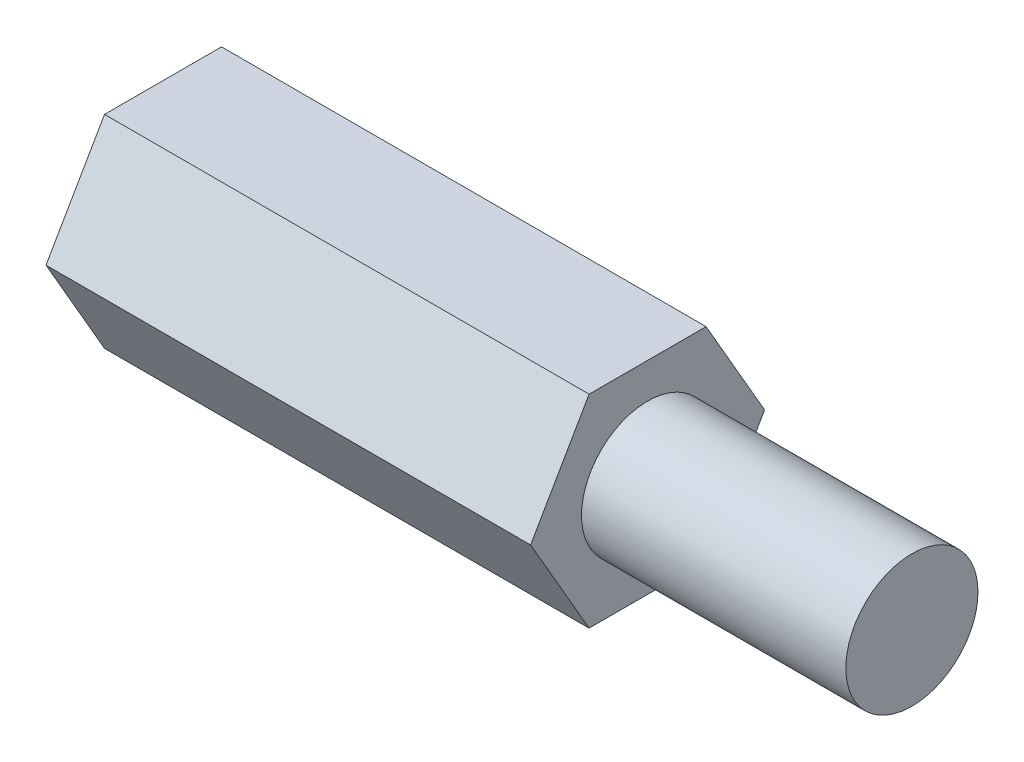
ISO-10303-21;
HEADER;
FILE_DESCRIPTION(('STEP AP214'),'2;1');
FILE_NAME('part.step','',(''),(''),'','','');
FILE_SCHEMA(('AUTOMOTIVE_DESIGN { 1 0 10303 214 1 1 1 1 }'));
ENDSEC;
DATA;
#1=APPLICATION_CONTEXT('core data for automotive mechanical design processes');
#2=APPLICATION_PROTOCOL_DEFINITION('international standard','automotive_design',2000,#1);
#3=PRODUCT_CONTEXT('',#1,'mechanical');
#4=PRODUCT('Part','Part','',(#3));
#5=PRODUCT_RELATED_PRODUCT_CATEGORY('part','',(#4));
#6=PRODUCT_DEFINITION_FORMATION('','',#4);
#7=PRODUCT_DEFINITION_CONTEXT('part definition',#1,'design');
#8=PRODUCT_DEFINITION('design','',#6,#7);
#9=PRODUCT_DEFINITION_SHAPE('','',#8);
#10=(LENGTH_UNIT() NAMED_UNIT(*) SI_UNIT(.MILLI.,.METRE.));
#11=(NAMED_UNIT(*) PLANE_ANGLE_UNIT() SI_UNIT($,.RADIAN.));
#12=(NAMED_UNIT(*) SI_UNIT($,.STERADIAN.) SOLID_ANGLE_UNIT());
#13=UNCERTAINTY_MEASURE_WITH_UNIT(LENGTH_MEASURE(1.E-05),#10,'distance_accuracy_value','');
#14=(GEOMETRIC_REPRESENTATION_CONTEXT(3) GLOBAL_UNCERTAINTY_ASSIGNED_CONTEXT((#13)) GLOBAL_UNIT_ASSIGNED_CONTEXT((#10,
#11,#12)) REPRESENTATION_CONTEXT('',''));
#15=CARTESIAN_POINT('',(0.,0.,0.));
#16=DIRECTION('',(0.,0.,1.));
#17=DIRECTION('',(1.,0.,0.));
#18=AXIS2_PLACEMENT_3D('',#15,#16,#17);
#19=CARTESIAN_POINT('',(11.,0.,0.));
#20=DIRECTION('',(1.,0.,0.));
#21=DIRECTION('',(0.,0.,-1.));
#22=AXIS2_PLACEMENT_3D('',#19,#20,#21);
#23=PLANE('',#22);
#24=CARTESIAN_POINT('',(11.,0.,0.));
#25=DIRECTION('',(1.,0.,0.));
#26=DIRECTION('',(0.,0.,-1.));
#27=AXIS2_PLACEMENT_3D('',#24,#25,#26);
#28=CIRCLE('',#27,1.5);
#29=CARTESIAN_POINT('',(11.,0.,-1.5));
#30=VERTEX_POINT('',#29);
#31=EDGE_CURVE('E11',#30,#30,#28,.T.);
#32=ORIENTED_EDGE('',*,*,#31,.F.);
#33=EDGE_LOOP('',(#32));
#34=FACE_BOUND('',#33,.T.);
#35=DIRECTION('',(0.,0.866025403784439,0.5));
#36=VECTOR('',#35,1.);
#37=CARTESIAN_POINT('',(11.,0.,-2.65581123827228));
#38=LINE('',#37,#36);
#39=CARTESIAN_POINT('',(11.,0.,-2.65581123827228));
#40=VERTEX_POINT('',#39);
#41=CARTESIAN_POINT('',(11.,2.3,-1.32790561913614));
#42=VERTEX_POINT('',#41);
#43=EDGE_CURVE('E136',#40,#42,#38,.T.);
#44=ORIENTED_EDGE('',*,*,#43,.T.);
#45=DIRECTION('',(0.,0.,1.));
#46=VECTOR('',#45,1.);
#47=CARTESIAN_POINT('',(11.,2.3,-1.32790561913614));
#48=LINE('',#47,#46);
#49=CARTESIAN_POINT('',(11.,2.3,1.32790561913614));
#50=VERTEX_POINT('',#49);
#51=EDGE_CURVE('E92',#42,#50,#48,.T.);
#52=ORIENTED_EDGE('',*,*,#51,.T.);
#53=DIRECTION('',(0.,-0.866025403784439,0.5));
#54=VECTOR('',#53,1.);
#55=CARTESIAN_POINT('',(11.,2.3,1.32790561913614));
#56=LINE('',#55,#54);
#57=CARTESIAN_POINT('',(11.,0.,2.65581123827228));
#58=VERTEX_POINT('',#57);
#59=EDGE_CURVE('E104',#50,#58,#56,.T.);
#60=ORIENTED_EDGE('',*,*,#59,.T.);
#61=DIRECTION('',(0.,-0.866025403784439,-0.5));
#62=VECTOR('',#61,1.);
#63=CARTESIAN_POINT('',(11.,0.,2.65581123827228));
#64=LINE('',#63,#62);
#65=CARTESIAN_POINT('',(11.,-2.3,1.32790561913614));
#66=VERTEX_POINT('',#65);
#67=EDGE_CURVE('E99',#58,#66,#64,.T.);
#68=ORIENTED_EDGE('',*,*,#67,.T.);
#69=DIRECTION('',(0.,0.,-1.));
#70=VECTOR('',#69,1.);
#71=CARTESIAN_POINT('',(11.,-2.3,1.32790561913614));
#72=LINE('',#71,#70);
#73=CARTESIAN_POINT('',(11.,-2.3,-1.32790561913614));
#74=VERTEX_POINT('',#73);
#75=EDGE_CURVE('E102',#66,#74,#72,.T.);
#76=ORIENTED_EDGE('',*,*,#75,.T.);
#77=DIRECTION('',(0.,0.866025403784439,-0.5));
#78=VECTOR('',#77,1.);
#79=CARTESIAN_POINT('',(11.,-2.3,-1.32790561913614));
#80=LINE('',#79,#78);
#81=EDGE_CURVE('E56',#74,#40,#80,.T.);
#82=ORIENTED_EDGE('',*,*,#81,.T.);
#83=EDGE_LOOP('',(#44,#52,#60,#68,#76,#82));
#84=FACE_BOUND('',#83,.T.);
#85=ADVANCED_FACE('F38',(#34,#84),#23,.T.);
#86=CARTESIAN_POINT('',(0.,0.,0.));
#87=DIRECTION('',(1.,0.,0.));
#88=DIRECTION('',(0.,0.,-1.));
#89=AXIS2_PLACEMENT_3D('',#86,#87,#88);
#90=PLANE('',#89);
#91=DIRECTION('',(0.,0.866025403784439,0.5));
#92=VECTOR('',#91,1.);
#93=CARTESIAN_POINT('',(0.,0.,-2.65581123827228));
#94=LINE('',#93,#92);
#95=CARTESIAN_POINT('',(0.,0.,-2.65581123827228));
#96=VERTEX_POINT('',#95);
#97=CARTESIAN_POINT('',(0.,2.3,-1.32790561913614));
#98=VERTEX_POINT('',#97);
#99=EDGE_CURVE('E122',#96,#98,#94,.T.);
#100=ORIENTED_EDGE('',*,*,#99,.F.);
#101=DIRECTION('',(0.,0.866025403784439,-0.5));
#102=VECTOR('',#101,1.);
#103=CARTESIAN_POINT('',(0.,-2.3,-1.32790561913614));
#104=LINE('',#103,#102);
#105=CARTESIAN_POINT('',(0.,-2.3,-1.32790561913614));
#106=VERTEX_POINT('',#105);
#107=EDGE_CURVE('E134',#106,#96,#104,.T.);
#108=ORIENTED_EDGE('',*,*,#107,.F.);
#109=DIRECTION('',(0.,0.,-1.));
#110=VECTOR('',#109,1.);
#111=CARTESIAN_POINT('',(0.,-2.3,1.32790561913614));
#112=LINE('',#111,#110);
#113=CARTESIAN_POINT('',(0.,-2.3,1.32790561913614));
#114=VERTEX_POINT('',#113);
#115=EDGE_CURVE('E132',#114,#106,#112,.T.);
#116=ORIENTED_EDGE('',*,*,#115,.F.);
#117=DIRECTION('',(0.,-0.866025403784439,-0.5));
#118=VECTOR('',#117,1.);
#119=CARTESIAN_POINT('',(0.,0.,2.65581123827228));
#120=LINE('',#119,#118);
#121=CARTESIAN_POINT('',(0.,0.,2.65581123827228));
#122=VERTEX_POINT('',#121);
#123=EDGE_CURVE('E112',#122,#114,#120,.T.);
#124=ORIENTED_EDGE('',*,*,#123,.F.);
#125=DIRECTION('',(0.,-0.866025403784439,0.5));
#126=VECTOR('',#125,1.);
#127=CARTESIAN_POINT('',(0.,2.3,1.32790561913614));
#128=LINE('',#127,#126);
#129=CARTESIAN_POINT('',(0.,2.3,1.32790561913614));
#130=VERTEX_POINT('',#129);
#131=EDGE_CURVE('E128',#130,#122,#128,.T.);
#132=ORIENTED_EDGE('',*,*,#131,.F.);
#133=DIRECTION('',(0.,0.,1.));
#134=VECTOR('',#133,1.);
#135=CARTESIAN_POINT('',(0.,2.3,-1.32790561913614));
#136=LINE('',#135,#134);
#137=EDGE_CURVE('E124',#98,#130,#136,.T.);
#138=ORIENTED_EDGE('',*,*,#137,.F.);
#139=EDGE_LOOP('',(#100,#108,#116,#124,#132,#138));
#140=FACE_BOUND('',#139,.T.);
#141=CARTESIAN_POINT('',(0.,0.,0.));
#142=DIRECTION('',(1.,0.,0.));
#143=DIRECTION('',(0.,0.,-1.));
#144=AXIS2_PLACEMENT_3D('',#141,#142,#143);
#145=CIRCLE('',#144,1.5);
#146=CARTESIAN_POINT('',(0.,0.,-1.5));
#147=VERTEX_POINT('',#146);
#148=EDGE_CURVE('E125',#147,#147,#145,.T.);
#149=ORIENTED_EDGE('',*,*,#148,.T.);
#150=EDGE_LOOP('',(#149));
#151=FACE_BOUND('',#150,.T.);
#152=ADVANCED_FACE('F169',(#140,#151),#90,.F.);
#153=CARTESIAN_POINT('',(11.,0.,-2.65581123827228));
#154=DIRECTION('',(0.,-0.5,0.866025403784439));
#155=DIRECTION('',(0.,-0.866025403784439,-0.5));
#156=AXIS2_PLACEMENT_3D('',#153,#154,#155);
#157=PLANE('',#156);
#158=ORIENTED_EDGE('',*,*,#99,.T.);
#159=DIRECTION('',(-1.,0.,0.));
#160=VECTOR('',#159,1.);
#161=CARTESIAN_POINT('',(11.,2.3,-1.32790561913614));
#162=LINE('',#161,#160);
#163=EDGE_CURVE('E141',#42,#98,#162,.T.);
#164=ORIENTED_EDGE('',*,*,#163,.F.);
#165=ORIENTED_EDGE('',*,*,#43,.F.);
#166=DIRECTION('',(-1.,0.,0.));
#167=VECTOR('',#166,1.);
#168=CARTESIAN_POINT('',(11.,0.,-2.65581123827228));
#169=LINE('',#168,#167);
#170=EDGE_CURVE('E85',#40,#96,#169,.T.);
#171=ORIENTED_EDGE('',*,*,#170,.T.);
#172=EDGE_LOOP('',(#158,#164,#165,#171));
#173=FACE_BOUND('',#172,.T.);
#174=ADVANCED_FACE('F40',(#173),#157,.F.);
#175=CARTESIAN_POINT('',(11.,2.3,-1.32790561913614));
#176=DIRECTION('',(0.,-1.,0.));
#177=DIRECTION('',(0.,0.,-1.));
#178=AXIS2_PLACEMENT_3D('',#175,#176,#177);
#179=PLANE('',#178);
#180=ORIENTED_EDGE('',*,*,#137,.T.);
#181=DIRECTION('',(-1.,0.,0.));
#182=VECTOR('',#181,1.);
#183=CARTESIAN_POINT('',(11.,2.3,1.32790561913614));
#184=LINE('',#183,#182);
#185=EDGE_CURVE('E140',#50,#130,#184,.T.);
#186=ORIENTED_EDGE('',*,*,#185,.F.);
#187=ORIENTED_EDGE('',*,*,#51,.F.);
#188=ORIENTED_EDGE('',*,*,#163,.T.);
#189=EDGE_LOOP('',(#180,#186,#187,#188));
#190=FACE_BOUND('',#189,.T.);
#191=ADVANCED_FACE('F163',(#190),#179,.F.);
#192=CARTESIAN_POINT('',(11.,2.3,1.32790561913614));
#193=DIRECTION('',(0.,-0.5,-0.866025403784439));
#194=DIRECTION('',(0.,0.866025403784439,-0.5));
#195=AXIS2_PLACEMENT_3D('',#192,#193,#194);
#196=PLANE('',#195);
#197=ORIENTED_EDGE('',*,*,#131,.T.);
#198=DIRECTION('',(-1.,0.,0.));
#199=VECTOR('',#198,1.);
#200=CARTESIAN_POINT('',(11.,0.,2.65581123827228));
#201=LINE('',#200,#199);
#202=EDGE_CURVE('E115',#58,#122,#201,.T.);
#203=ORIENTED_EDGE('',*,*,#202,.F.);
#204=ORIENTED_EDGE('',*,*,#59,.F.);
#205=ORIENTED_EDGE('',*,*,#185,.T.);
#206=EDGE_LOOP('',(#197,#203,#204,#205));
#207=FACE_BOUND('',#206,.T.);
#208=ADVANCED_FACE('F166',(#207),#196,.F.);
#209=CARTESIAN_POINT('',(11.,0.,2.65581123827228));
#210=DIRECTION('',(0.,0.5,-0.866025403784439));
#211=DIRECTION('',(0.,0.866025403784439,0.5));
#212=AXIS2_PLACEMENT_3D('',#209,#210,#211);
#213=PLANE('',#212);
#214=ORIENTED_EDGE('',*,*,#123,.T.);
#215=DIRECTION('',(-1.,0.,0.));
#216=VECTOR('',#215,1.);
#217=CARTESIAN_POINT('',(11.,-2.3,1.32790561913614));
#218=LINE('',#217,#216);
#219=EDGE_CURVE('E109',#66,#114,#218,.T.);
#220=ORIENTED_EDGE('',*,*,#219,.F.);
#221=ORIENTED_EDGE('',*,*,#67,.F.);
#222=ORIENTED_EDGE('',*,*,#202,.T.);
#223=EDGE_LOOP('',(#214,#220,#221,#222));
#224=FACE_BOUND('',#223,.T.);
#225=ADVANCED_FACE('F110',(#224),#213,.F.);
#226=CARTESIAN_POINT('',(11.,-2.3,1.32790561913614));
#227=DIRECTION('',(0.,1.,0.));
#228=DIRECTION('',(0.,0.,1.));
#229=AXIS2_PLACEMENT_3D('',#226,#227,#228);
#230=PLANE('',#229);
#231=ORIENTED_EDGE('',*,*,#115,.T.);
#232=DIRECTION('',(-1.,0.,0.));
#233=VECTOR('',#232,1.);
#234=CARTESIAN_POINT('',(11.,-2.3,-1.32790561913614));
#235=LINE('',#234,#233);
#236=EDGE_CURVE('E78',#74,#106,#235,.T.);
#237=ORIENTED_EDGE('',*,*,#236,.F.);
#238=ORIENTED_EDGE('',*,*,#75,.F.);
#239=ORIENTED_EDGE('',*,*,#219,.T.);
#240=EDGE_LOOP('',(#231,#237,#238,#239));
#241=FACE_BOUND('',#240,.T.);
#242=ADVANCED_FACE('F117',(#241),#230,.F.);
#243=CARTESIAN_POINT('',(11.,-2.3,-1.32790561913614));
#244=DIRECTION('',(0.,0.5,0.866025403784439));
#245=DIRECTION('',(0.,-0.866025403784439,0.5));
#246=AXIS2_PLACEMENT_3D('',#243,#244,#245);
#247=PLANE('',#246);
#248=ORIENTED_EDGE('',*,*,#107,.T.);
#249=ORIENTED_EDGE('',*,*,#170,.F.);
#250=ORIENTED_EDGE('',*,*,#81,.F.);
#251=ORIENTED_EDGE('',*,*,#236,.T.);
#252=EDGE_LOOP('',(#248,#249,#250,#251));
#253=FACE_BOUND('',#252,.T.);
#254=ADVANCED_FACE('F152',(#253),#247,.F.);
#255=CARTESIAN_POINT('',(11.,0.,0.));
#256=DIRECTION('',(-1.,0.,0.));
#257=DIRECTION('',(0.,0.,1.));
#258=AXIS2_PLACEMENT_3D('',#255,#256,#257);
#259=CYLINDRICAL_SURFACE('',#258,1.5);
#260=CARTESIAN_POINT('',(9.,0.,0.));
#261=DIRECTION('',(-1.,0.,0.));
#262=DIRECTION('',(0.,0.,1.));
#263=AXIS2_PLACEMENT_3D('',#260,#261,#262);
#264=CIRCLE('',#263,1.5);
#265=CARTESIAN_POINT('',(9.,0.,1.5));
#266=VERTEX_POINT('',#265);
#267=EDGE_CURVE('E42',#266,#266,#264,.T.);
#268=ORIENTED_EDGE('',*,*,#267,.F.);
#269=EDGE_LOOP('',(#268));
#270=FACE_BOUND('',#269,.T.);
#271=ORIENTED_EDGE('',*,*,#148,.F.);
#272=EDGE_LOOP('',(#271));
#273=FACE_BOUND('',#272,.T.);
#274=ADVANCED_FACE('F149',(#270,#273),#259,.F.);
#275=CARTESIAN_POINT('',(9.,0.,0.));
#276=DIRECTION('',(-1.,0.,0.));
#277=DIRECTION('',(0.,0.,1.));
#278=AXIS2_PLACEMENT_3D('',#275,#276,#277);
#279=PLANE('',#278);
#280=ORIENTED_EDGE('',*,*,#267,.T.);
#281=EDGE_LOOP('',(#280));
#282=FACE_BOUND('',#281,.T.);
#283=ADVANCED_FACE('F147',(#282),#279,.T.);
#284=CARTESIAN_POINT('',(17.,0.,0.));
#285=DIRECTION('',(-1.,0.,0.));
#286=DIRECTION('',(0.,0.,1.));
#287=AXIS2_PLACEMENT_3D('',#284,#285,#286);
#288=CYLINDRICAL_SURFACE('',#287,1.5);
#289=CARTESIAN_POINT('',(17.,0.,0.));
#290=DIRECTION('',(1.,0.,0.));
#291=DIRECTION('',(0.,0.,-1.));
#292=AXIS2_PLACEMENT_3D('',#289,#290,#291);
#293=CIRCLE('',#292,1.5);
#294=CARTESIAN_POINT('',(17.,0.,-1.5));
#295=VERTEX_POINT('',#294);
#296=EDGE_CURVE('E157',#295,#295,#293,.T.);
#297=ORIENTED_EDGE('',*,*,#296,.F.);
#298=EDGE_LOOP('',(#297));
#299=FACE_BOUND('',#298,.T.);
#300=ORIENTED_EDGE('',*,*,#31,.T.);
#301=EDGE_LOOP('',(#300));
#302=FACE_BOUND('',#301,.T.);
#303=ADVANCED_FACE('F218',(#299,#302),#288,.T.);
#304=CARTESIAN_POINT('',(17.,0.,0.));
#305=DIRECTION('',(1.,0.,0.));
#306=DIRECTION('',(0.,0.,-1.));
#307=AXIS2_PLACEMENT_3D('',#304,#305,#306);
#308=PLANE('',#307);
#309=ORIENTED_EDGE('',*,*,#296,.T.);
#310=EDGE_LOOP('',(#309));
#311=FACE_BOUND('',#310,.T.);
#312=ADVANCED_FACE('F224',(#311),#308,.T.);
#313=CLOSED_SHELL('',(#85,#152,#174,#191,#208,#225,#242,#254,#274,#283,#303,#312));
#314=MANIFOLD_SOLID_BREP('B2',#313);
#315=ADVANCED_BREP_SHAPE_REPRESENTATION('',(#18,#314),#14);
#316=SHAPE_DEFINITION_REPRESENTATION(#9,#315);
ENDSEC;
END-ISO-10303-21;
